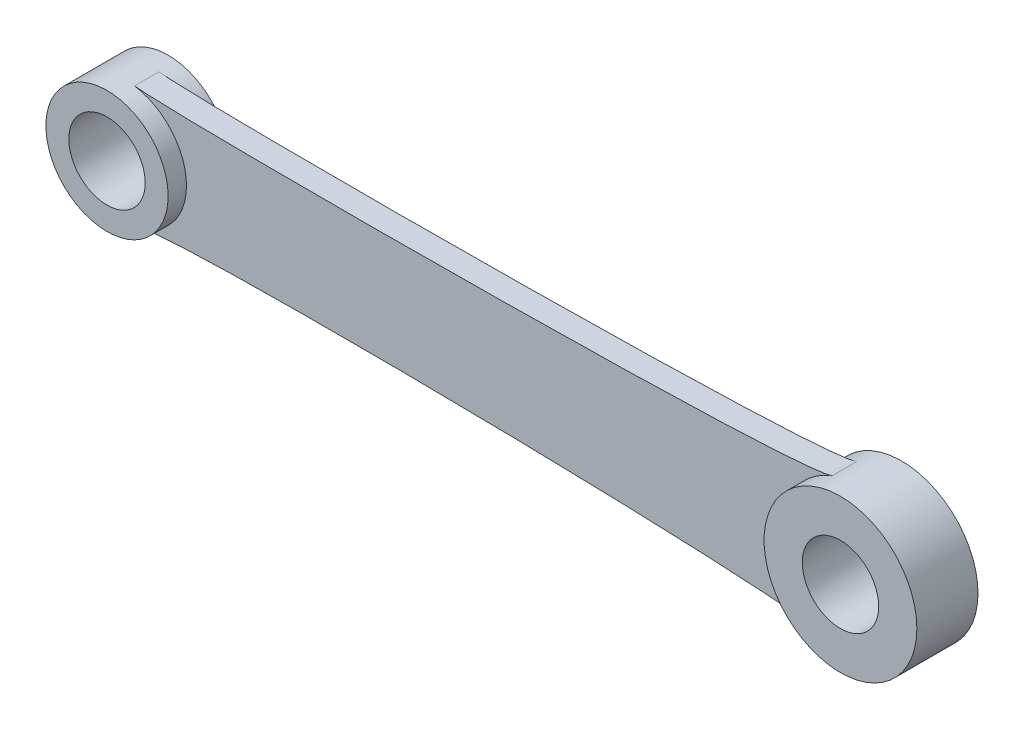
ISO-10303-21;
HEADER;
FILE_DESCRIPTION(('STEP AP214'),'2;1');
FILE_NAME('part.step','',(''),(''),'','','');
FILE_SCHEMA(('AUTOMOTIVE_DESIGN { 1 0 10303 214 1 1 1 1 }'));
ENDSEC;
DATA;
#1=APPLICATION_CONTEXT('core data for automotive mechanical design processes');
#2=APPLICATION_PROTOCOL_DEFINITION('international standard','automotive_design',2000,#1);
#3=PRODUCT_CONTEXT('',#1,'mechanical');
#4=PRODUCT('Part','Part','',(#3));
#5=PRODUCT_RELATED_PRODUCT_CATEGORY('part','',(#4));
#6=PRODUCT_DEFINITION_FORMATION('','',#4);
#7=PRODUCT_DEFINITION_CONTEXT('part definition',#1,'design');
#8=PRODUCT_DEFINITION('design','',#6,#7);
#9=PRODUCT_DEFINITION_SHAPE('','',#8);
#10=(LENGTH_UNIT() NAMED_UNIT(*) SI_UNIT(.MILLI.,.METRE.));
#11=(NAMED_UNIT(*) PLANE_ANGLE_UNIT() SI_UNIT($,.RADIAN.));
#12=(NAMED_UNIT(*) SI_UNIT($,.STERADIAN.) SOLID_ANGLE_UNIT());
#13=UNCERTAINTY_MEASURE_WITH_UNIT(LENGTH_MEASURE(1.E-05),#10,'distance_accuracy_value','');
#14=(GEOMETRIC_REPRESENTATION_CONTEXT(3) GLOBAL_UNCERTAINTY_ASSIGNED_CONTEXT((#13)) GLOBAL_UNIT_ASSIGNED_CONTEXT((#10,
#11,#12)) REPRESENTATION_CONTEXT('',''));
#15=CARTESIAN_POINT('',(0.,0.,0.));
#16=DIRECTION('',(0.,0.,1.));
#17=DIRECTION('',(1.,0.,0.));
#18=AXIS2_PLACEMENT_3D('',#15,#16,#17);
#19=CARTESIAN_POINT('',(3.61401413306096,-19.6707626147548,4.));
#20=CARTESIAN_POINT('',(18.1066190598977,-14.9319085588976,4.));
#21=CARTESIAN_POINT('',(216.225384026952,-17.8679110237978,4.));
#22=CARTESIAN_POINT('',(231.444145015717,-23.490367078543,4.));
#23=B_SPLINE_CURVE_WITH_KNOTS('',3,(#19,#20,#21,#22),.UNSPECIFIED.,.F.,.F.,(4,4),
(0.03360339382755,0.920970588737108),.UNSPECIFIED.);
#24=DIRECTION('',(0.,0.,-1.));
#25=VECTOR('',#24,1.);
#26=SURFACE_OF_LINEAR_EXTRUSION('',#23,#25);
#27=CARTESIAN_POINT('',(3.61401413306096,-19.6707626147548,-4.));
#28=CARTESIAN_POINT('',(18.1066190598977,-14.9319085588976,-4.));
#29=CARTESIAN_POINT('',(216.225384026952,-17.8679110237978,-4.));
#30=CARTESIAN_POINT('',(231.444145015717,-23.490367078543,-4.));
#31=B_SPLINE_CURVE_WITH_KNOTS('',3,(#27,#28,#29,#30),.UNSPECIFIED.,.F.,.F.,(4,4),
(0.03360339382755,0.920970588737108),.UNSPECIFIED.);
#32=CARTESIAN_POINT('',(5.32135372860871,-19.2790869725468,-4.));
#33=VERTEX_POINT('',#32);
#34=CARTESIAN_POINT('',(231.401749268285,-23.4748819880172,-4.));
#35=VERTEX_POINT('',#34);
#36=EDGE_CURVE('E98',#33,#35,#31,.T.);
#37=ORIENTED_EDGE('',*,*,#36,.T.);
#38=DIRECTION('',(0.,0.,-1.));
#39=VECTOR('',#38,1.);
#40=CARTESIAN_POINT('',(231.401749268285,-23.4748819880172,4.));
#41=LINE('',#40,#39);
#42=CARTESIAN_POINT('',(231.401749268285,-23.4748819880171,4.));
#43=VERTEX_POINT('',#42);
#44=EDGE_CURVE('E58',#43,#35,#41,.T.);
#45=ORIENTED_EDGE('',*,*,#44,.F.);
#46=CARTESIAN_POINT('',(5.32135372860871,-19.2790869725468,4.));
#47=VERTEX_POINT('',#46);
#48=EDGE_CURVE('E111',#47,#43,#23,.T.);
#49=ORIENTED_EDGE('',*,*,#48,.F.);
#50=DIRECTION('',(0.,0.,-1.));
#51=VECTOR('',#50,1.);
#52=CARTESIAN_POINT('',(5.32135372860871,-19.2790869725468,4.));
#53=LINE('',#52,#51);
#54=EDGE_CURVE('E12',#47,#33,#53,.T.);
#55=ORIENTED_EDGE('',*,*,#54,.T.);
#56=EDGE_LOOP('',(#37,#45,#49,#55));
#57=FACE_BOUND('',#56,.T.);
#58=ADVANCED_FACE('F50',(#57),#26,.F.);
#59=CARTESIAN_POINT('',(3.00556742509099,19.7728744610699,4.));
#60=CARTESIAN_POINT('',(18.9162222265226,17.7201107617373,4.));
#61=CARTESIAN_POINT('',(215.876421889179,18.2985625209446,4.));
#62=CARTESIAN_POINT('',(231.273379322618,23.4274644713488,4.));
#63=B_SPLINE_CURVE_WITH_KNOTS('',3,(#59,#60,#61,#62),.UNSPECIFIED.,.F.,.F.,(4,4),
(0.0279024901489286,0.919000917436795),.UNSPECIFIED.);
#64=DIRECTION('',(0.,0.,-1.));
#65=VECTOR('',#64,1.);
#66=SURFACE_OF_LINEAR_EXTRUSION('',#63,#65);
#67=CARTESIAN_POINT('',(3.00556742509099,19.7728744610699,-4.));
#68=CARTESIAN_POINT('',(18.9162222265226,17.7201107617373,-4.));
#69=CARTESIAN_POINT('',(215.876421889179,18.2985625209446,-4.));
#70=CARTESIAN_POINT('',(231.273379322618,23.4274644713488,-4.));
#71=B_SPLINE_CURVE_WITH_KNOTS('',3,(#67,#68,#69,#70),.UNSPECIFIED.,.F.,.F.,(4,4),
(0.0279024901489286,0.919000917436795),.UNSPECIFIED.);
#72=CARTESIAN_POINT('',(3.00556742509099,19.7728744610699,-4.));
#73=VERTEX_POINT('',#72);
#74=CARTESIAN_POINT('',(231.273379322618,23.4274644713488,-4.));
#75=VERTEX_POINT('',#74);
#76=EDGE_CURVE('E97',#73,#75,#71,.T.);
#77=ORIENTED_EDGE('',*,*,#76,.F.);
#78=DIRECTION('',(0.,0.,-1.));
#79=VECTOR('',#78,1.);
#80=CARTESIAN_POINT('',(3.00556742509099,19.7728744610699,4.));
#81=LINE('',#80,#79);
#82=CARTESIAN_POINT('',(3.00556742509099,19.7728744610699,4.));
#83=VERTEX_POINT('',#82);
#84=EDGE_CURVE('E65',#83,#73,#81,.T.);
#85=ORIENTED_EDGE('',*,*,#84,.F.);
#86=CARTESIAN_POINT('',(231.273379322618,23.4274644713488,4.));
#87=VERTEX_POINT('',#86);
#88=EDGE_CURVE('E105',#83,#87,#63,.T.);
#89=ORIENTED_EDGE('',*,*,#88,.T.);
#90=DIRECTION('',(0.,0.,-1.));
#91=VECTOR('',#90,1.);
#92=CARTESIAN_POINT('',(231.273379322618,23.4274644713488,4.));
#93=LINE('',#92,#91);
#94=EDGE_CURVE('E92',#87,#75,#93,.T.);
#95=ORIENTED_EDGE('',*,*,#94,.T.);
#96=EDGE_LOOP('',(#77,#85,#89,#95));
#97=FACE_BOUND('',#96,.T.);
#98=ADVANCED_FACE('F103',(#97),#66,.T.);
#99=CARTESIAN_POINT('',(0.,0.,4.));
#100=DIRECTION('',(0.,0.,1.));
#101=DIRECTION('',(1.,0.,0.));
#102=AXIS2_PLACEMENT_3D('',#99,#100,#101);
#103=PLANE('',#102);
#104=CARTESIAN_POINT('',(0.,0.,4.));
#105=DIRECTION('',(0.,0.,1.));
#106=DIRECTION('',(1.,0.,0.));
#107=AXIS2_PLACEMENT_3D('',#104,#105,#106);
#108=CIRCLE('',#107,20.);
#109=EDGE_CURVE('E109',#47,#83,#108,.T.);
#110=ORIENTED_EDGE('',*,*,#109,.F.);
#111=ORIENTED_EDGE('',*,*,#48,.T.);
#112=CARTESIAN_POINT('',(240.,6.86936480440128E-11,4.));
#113=DIRECTION('',(0.,0.,1.));
#114=DIRECTION('',(1.,0.,0.));
#115=AXIS2_PLACEMENT_3D('',#112,#113,#114);
#116=CIRCLE('',#115,25.);
#117=EDGE_CURVE('E120',#87,#43,#116,.T.);
#118=ORIENTED_EDGE('',*,*,#117,.F.);
#119=ORIENTED_EDGE('',*,*,#88,.F.);
#120=EDGE_LOOP('',(#110,#111,#118,#119));
#121=FACE_BOUND('',#120,.T.);
#122=ADVANCED_FACE('F132',(#121),#103,.T.);
#123=CARTESIAN_POINT('',(0.,0.,-4.));
#124=DIRECTION('',(0.,0.,1.));
#125=DIRECTION('',(1.,0.,0.));
#126=AXIS2_PLACEMENT_3D('',#123,#124,#125);
#127=PLANE('',#126);
#128=CARTESIAN_POINT('',(0.,0.,-4.));
#129=DIRECTION('',(0.,0.,1.));
#130=DIRECTION('',(1.,0.,0.));
#131=AXIS2_PLACEMENT_3D('',#128,#129,#130);
#132=CIRCLE('',#131,20.);
#133=EDGE_CURVE('E108',#33,#73,#132,.T.);
#134=ORIENTED_EDGE('',*,*,#133,.T.);
#135=ORIENTED_EDGE('',*,*,#76,.T.);
#136=CARTESIAN_POINT('',(240.,6.86936480440128E-11,-4.));
#137=DIRECTION('',(0.,0.,1.));
#138=DIRECTION('',(1.,0.,0.));
#139=AXIS2_PLACEMENT_3D('',#136,#137,#138);
#140=CIRCLE('',#139,25.);
#141=EDGE_CURVE('E88',#75,#35,#140,.T.);
#142=ORIENTED_EDGE('',*,*,#141,.T.);
#143=ORIENTED_EDGE('',*,*,#36,.F.);
#144=EDGE_LOOP('',(#134,#135,#142,#143));
#145=FACE_BOUND('',#144,.T.);
#146=ADVANCED_FACE('F107',(#145),#127,.F.);
#147=CARTESIAN_POINT('',(0.,0.,10.));
#148=DIRECTION('',(0.,0.,1.));
#149=DIRECTION('',(1.,0.,0.));
#150=AXIS2_PLACEMENT_3D('',#147,#148,#149);
#151=PLANE('',#150);
#152=CARTESIAN_POINT('',(0.,0.,10.));
#153=DIRECTION('',(0.,0.,1.));
#154=DIRECTION('',(1.,0.,0.));
#155=AXIS2_PLACEMENT_3D('',#152,#153,#154);
#156=CIRCLE('',#155,20.);
#157=CARTESIAN_POINT('',(20.,0.,10.));
#158=VERTEX_POINT('',#157);
#159=EDGE_CURVE('E173',#158,#158,#156,.T.);
#160=ORIENTED_EDGE('',*,*,#159,.T.);
#161=EDGE_LOOP('',(#160));
#162=FACE_BOUND('',#161,.T.);
#163=CARTESIAN_POINT('',(0.,0.,10.));
#164=DIRECTION('',(0.,0.,1.));
#165=DIRECTION('',(1.,0.,0.));
#166=AXIS2_PLACEMENT_3D('',#163,#164,#165);
#167=CIRCLE('',#166,12.5);
#168=CARTESIAN_POINT('',(12.5,0.,10.));
#169=VERTEX_POINT('',#168);
#170=EDGE_CURVE('E184',#169,#169,#167,.T.);
#171=ORIENTED_EDGE('',*,*,#170,.F.);
#172=EDGE_LOOP('',(#171));
#173=FACE_BOUND('',#172,.T.);
#174=ADVANCED_FACE('F135',(#162,#173),#151,.T.);
#175=CARTESIAN_POINT('',(0.,0.,-10.));
#176=DIRECTION('',(0.,0.,1.));
#177=DIRECTION('',(1.,0.,0.));
#178=AXIS2_PLACEMENT_3D('',#175,#176,#177);
#179=PLANE('',#178);
#180=CARTESIAN_POINT('',(0.,0.,-10.));
#181=DIRECTION('',(0.,0.,1.));
#182=DIRECTION('',(1.,0.,0.));
#183=AXIS2_PLACEMENT_3D('',#180,#181,#182);
#184=CIRCLE('',#183,20.);
#185=CARTESIAN_POINT('',(20.,0.,-10.));
#186=VERTEX_POINT('',#185);
#187=EDGE_CURVE('E180',#186,#186,#184,.T.);
#188=ORIENTED_EDGE('',*,*,#187,.F.);
#189=EDGE_LOOP('',(#188));
#190=FACE_BOUND('',#189,.T.);
#191=CARTESIAN_POINT('',(0.,0.,-10.));
#192=DIRECTION('',(0.,0.,1.));
#193=DIRECTION('',(1.,0.,0.));
#194=AXIS2_PLACEMENT_3D('',#191,#192,#193);
#195=CIRCLE('',#194,12.5);
#196=CARTESIAN_POINT('',(12.5,0.,-10.));
#197=VERTEX_POINT('',#196);
#198=EDGE_CURVE('E187',#197,#197,#195,.T.);
#199=ORIENTED_EDGE('',*,*,#198,.T.);
#200=EDGE_LOOP('',(#199));
#201=FACE_BOUND('',#200,.T.);
#202=ADVANCED_FACE('F143',(#190,#201),#179,.F.);
#203=CARTESIAN_POINT('',(0.,0.,10.));
#204=DIRECTION('',(0.,0.,-1.));
#205=DIRECTION('',(-1.,0.,0.));
#206=AXIS2_PLACEMENT_3D('',#203,#204,#205);
#207=CYLINDRICAL_SURFACE('',#206,20.);
#208=ORIENTED_EDGE('',*,*,#109,.T.);
#209=ORIENTED_EDGE('',*,*,#84,.T.);
#210=ORIENTED_EDGE('',*,*,#133,.F.);
#211=ORIENTED_EDGE('',*,*,#54,.F.);
#212=EDGE_LOOP('',(#208,#209,#210,#211));
#213=FACE_BOUND('',#212,.T.);
#214=ORIENTED_EDGE('',*,*,#159,.F.);
#215=EDGE_LOOP('',(#214));
#216=FACE_BOUND('',#215,.T.);
#217=ORIENTED_EDGE('',*,*,#187,.T.);
#218=EDGE_LOOP('',(#217));
#219=FACE_BOUND('',#218,.T.);
#220=ADVANCED_FACE('F139',(#213,#216,#219),#207,.T.);
#221=CARTESIAN_POINT('',(0.,0.,10.));
#222=DIRECTION('',(0.,0.,-1.));
#223=DIRECTION('',(-1.,0.,0.));
#224=AXIS2_PLACEMENT_3D('',#221,#222,#223);
#225=CYLINDRICAL_SURFACE('',#224,12.5);
#226=ORIENTED_EDGE('',*,*,#170,.T.);
#227=EDGE_LOOP('',(#226));
#228=FACE_BOUND('',#227,.T.);
#229=ORIENTED_EDGE('',*,*,#198,.F.);
#230=EDGE_LOOP('',(#229));
#231=FACE_BOUND('',#230,.T.);
#232=ADVANCED_FACE('F142',(#228,#231),#225,.F.);
#233=CARTESIAN_POINT('',(240.,6.86936480440128E-11,10.));
#234=DIRECTION('',(0.,0.,1.));
#235=DIRECTION('',(1.,0.,0.));
#236=AXIS2_PLACEMENT_3D('',#233,#234,#235);
#237=PLANE('',#236);
#238=CARTESIAN_POINT('',(240.,6.86936480440128E-11,10.));
#239=DIRECTION('',(0.,0.,1.));
#240=DIRECTION('',(1.,0.,0.));
#241=AXIS2_PLACEMENT_3D('',#238,#239,#240);
#242=CIRCLE('',#241,25.);
#243=CARTESIAN_POINT('',(265.,6.86936480440128E-11,10.));
#244=VERTEX_POINT('',#243);
#245=EDGE_CURVE('E215',#244,#244,#242,.T.);
#246=ORIENTED_EDGE('',*,*,#245,.T.);
#247=EDGE_LOOP('',(#246));
#248=FACE_BOUND('',#247,.T.);
#249=CARTESIAN_POINT('',(240.,6.86936480440128E-11,10.));
#250=DIRECTION('',(0.,0.,1.));
#251=DIRECTION('',(1.,0.,0.));
#252=AXIS2_PLACEMENT_3D('',#249,#250,#251);
#253=CIRCLE('',#252,12.5);
#254=CARTESIAN_POINT('',(252.5,6.86936480440128E-11,10.));
#255=VERTEX_POINT('',#254);
#256=EDGE_CURVE('E207',#255,#255,#253,.T.);
#257=ORIENTED_EDGE('',*,*,#256,.F.);
#258=EDGE_LOOP('',(#257));
#259=FACE_BOUND('',#258,.T.);
#260=ADVANCED_FACE('F152',(#248,#259),#237,.T.);
#261=CARTESIAN_POINT('',(240.,6.86936480440128E-11,-10.));
#262=DIRECTION('',(0.,0.,1.));
#263=DIRECTION('',(1.,0.,0.));
#264=AXIS2_PLACEMENT_3D('',#261,#262,#263);
#265=PLANE('',#264);
#266=CARTESIAN_POINT('',(240.,6.86936480440128E-11,-10.));
#267=DIRECTION('',(0.,0.,1.));
#268=DIRECTION('',(1.,0.,0.));
#269=AXIS2_PLACEMENT_3D('',#266,#267,#268);
#270=CIRCLE('',#269,25.);
#271=CARTESIAN_POINT('',(265.,6.86936480440128E-11,-10.));
#272=VERTEX_POINT('',#271);
#273=EDGE_CURVE('E212',#272,#272,#270,.T.);
#274=ORIENTED_EDGE('',*,*,#273,.F.);
#275=EDGE_LOOP('',(#274));
#276=FACE_BOUND('',#275,.T.);
#277=CARTESIAN_POINT('',(240.,6.86936480440128E-11,-10.));
#278=DIRECTION('',(0.,0.,1.));
#279=DIRECTION('',(1.,0.,0.));
#280=AXIS2_PLACEMENT_3D('',#277,#278,#279);
#281=CIRCLE('',#280,12.5);
#282=CARTESIAN_POINT('',(252.5,6.86936480440128E-11,-10.));
#283=VERTEX_POINT('',#282);
#284=EDGE_CURVE('E204',#283,#283,#281,.T.);
#285=ORIENTED_EDGE('',*,*,#284,.T.);
#286=EDGE_LOOP('',(#285));
#287=FACE_BOUND('',#286,.T.);
#288=ADVANCED_FACE('F160',(#276,#287),#265,.F.);
#289=CARTESIAN_POINT('',(240.,6.86936480440128E-11,10.));
#290=DIRECTION('',(0.,0.,-1.));
#291=DIRECTION('',(-1.,0.,0.));
#292=AXIS2_PLACEMENT_3D('',#289,#290,#291);
#293=CYLINDRICAL_SURFACE('',#292,25.);
#294=ORIENTED_EDGE('',*,*,#117,.T.);
#295=ORIENTED_EDGE('',*,*,#44,.T.);
#296=ORIENTED_EDGE('',*,*,#141,.F.);
#297=ORIENTED_EDGE('',*,*,#94,.F.);
#298=EDGE_LOOP('',(#294,#295,#296,#297));
#299=FACE_BOUND('',#298,.T.);
#300=ORIENTED_EDGE('',*,*,#245,.F.);
#301=EDGE_LOOP('',(#300));
#302=FACE_BOUND('',#301,.T.);
#303=ORIENTED_EDGE('',*,*,#273,.T.);
#304=EDGE_LOOP('',(#303));
#305=FACE_BOUND('',#304,.T.);
#306=ADVANCED_FACE('F90',(#299,#302,#305),#293,.T.);
#307=CARTESIAN_POINT('',(240.,6.86936480440128E-11,10.));
#308=DIRECTION('',(0.,0.,-1.));
#309=DIRECTION('',(-1.,0.,0.));
#310=AXIS2_PLACEMENT_3D('',#307,#308,#309);
#311=CYLINDRICAL_SURFACE('',#310,12.5);
#312=ORIENTED_EDGE('',*,*,#256,.T.);
#313=EDGE_LOOP('',(#312));
#314=FACE_BOUND('',#313,.T.);
#315=ORIENTED_EDGE('',*,*,#284,.F.);
#316=EDGE_LOOP('',(#315));
#317=FACE_BOUND('',#316,.T.);
#318=ADVANCED_FACE('F154',(#314,#317),#311,.F.);
#319=CLOSED_SHELL('',(#58,#98,#122,#146,#174,#202,#220,#232,#260,#288,#306,#318));
#320=MANIFOLD_SOLID_BREP('B2',#319);
#321=ADVANCED_BREP_SHAPE_REPRESENTATION('',(#18,#320),#14);
#322=SHAPE_DEFINITION_REPRESENTATION(#9,#321);
ENDSEC;
END-ISO-10303-21;
